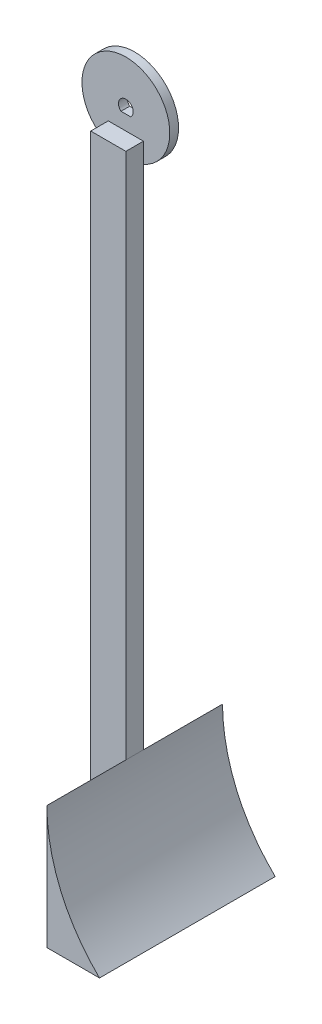
ISO-10303-21;
HEADER;
FILE_DESCRIPTION(('STEP AP214'),'2;1');
FILE_NAME('part.step','',(''),(''),'','','');
FILE_SCHEMA(('AUTOMOTIVE_DESIGN { 1 0 10303 214 1 1 1 1 }'));
ENDSEC;
DATA;
#1=APPLICATION_CONTEXT('core data for automotive mechanical design processes');
#2=APPLICATION_PROTOCOL_DEFINITION('international standard','automotive_design',2000,#1);
#3=PRODUCT_CONTEXT('',#1,'mechanical');
#4=PRODUCT('Part','Part','',(#3));
#5=PRODUCT_RELATED_PRODUCT_CATEGORY('part','',(#4));
#6=PRODUCT_DEFINITION_FORMATION('','',#4);
#7=PRODUCT_DEFINITION_CONTEXT('part definition',#1,'design');
#8=PRODUCT_DEFINITION('design','',#6,#7);
#9=PRODUCT_DEFINITION_SHAPE('','',#8);
#10=(LENGTH_UNIT() NAMED_UNIT(*) SI_UNIT(.MILLI.,.METRE.));
#11=(NAMED_UNIT(*) PLANE_ANGLE_UNIT() SI_UNIT($,.RADIAN.));
#12=(NAMED_UNIT(*) SI_UNIT($,.STERADIAN.) SOLID_ANGLE_UNIT());
#13=UNCERTAINTY_MEASURE_WITH_UNIT(LENGTH_MEASURE(1.E-05),#10,'distance_accuracy_value','');
#14=(GEOMETRIC_REPRESENTATION_CONTEXT(3) GLOBAL_UNCERTAINTY_ASSIGNED_CONTEXT((#13)) GLOBAL_UNIT_ASSIGNED_CONTEXT((#10,
#11,#12)) REPRESENTATION_CONTEXT('',''));
#15=CARTESIAN_POINT('',(0.,0.,0.));
#16=DIRECTION('',(0.,0.,1.));
#17=DIRECTION('',(1.,0.,0.));
#18=AXIS2_PLACEMENT_3D('',#15,#16,#17);
#19=CARTESIAN_POINT('',(5.,0.,0.));
#20=DIRECTION('',(1.,0.,0.));
#21=DIRECTION('',(0.,1.,0.));
#22=AXIS2_PLACEMENT_3D('',#19,#20,#21);
#23=PLANE('',#22);
#24=DIRECTION('',(0.,1.,0.));
#25=VECTOR('',#24,1.);
#26=CARTESIAN_POINT('',(5.,0.,7.5));
#27=LINE('',#26,#25);
#28=CARTESIAN_POINT('',(5.,-190.754430390358,7.5));
#29=VERTEX_POINT('',#28);
#30=CARTESIAN_POINT('',(5.00000000000002,-155.754430390358,7.49999999999999));
#31=VERTEX_POINT('',#30);
#32=EDGE_CURVE('E175',#29,#31,#27,.T.);
#33=ORIENTED_EDGE('',*,*,#32,.F.);
#34=DIRECTION('',(0.,0.,1.));
#35=VECTOR('',#34,1.);
#36=CARTESIAN_POINT('',(5.00000000000002,-190.754430390358,0.));
#37=LINE('',#36,#35);
#38=CARTESIAN_POINT('',(5.00000000000002,-190.754430390358,30.));
#39=VERTEX_POINT('',#38);
#40=EDGE_CURVE('E165',#29,#39,#37,.T.);
#41=ORIENTED_EDGE('',*,*,#40,.T.);
#42=DIRECTION('',(0.,-1.,0.));
#43=VECTOR('',#42,1.);
#44=CARTESIAN_POINT('',(5.,0.,30.));
#45=LINE('',#44,#43);
#46=CARTESIAN_POINT('',(5.00000000000002,-155.754430390358,30.));
#47=VERTEX_POINT('',#46);
#48=EDGE_CURVE('E308',#47,#39,#45,.T.);
#49=ORIENTED_EDGE('',*,*,#48,.F.);
#50=DIRECTION('',(0.,0.,-1.));
#51=VECTOR('',#50,1.);
#52=CARTESIAN_POINT('',(5.00000000000002,-155.754430390358,0.));
#53=LINE('',#52,#51);
#54=EDGE_CURVE('E155',#47,#31,#53,.T.);
#55=ORIENTED_EDGE('',*,*,#54,.T.);
#56=EDGE_LOOP('',(#33,#41,#49,#55));
#57=FACE_BOUND('',#56,.T.);
#58=ADVANCED_FACE('F47',(#57),#23,.F.);
#59=CARTESIAN_POINT('',(0.,0.,2.5));
#60=DIRECTION('',(0.,0.,-1.));
#61=DIRECTION('',(-1.,0.,0.));
#62=AXIS2_PLACEMENT_3D('',#59,#60,#61);
#63=CYLINDRICAL_SURFACE('',#62,2.1);
#64=CARTESIAN_POINT('',(0.,0.,0.));
#65=DIRECTION('',(0.,0.,1.));
#66=DIRECTION('',(1.,0.,0.));
#67=AXIS2_PLACEMENT_3D('',#64,#65,#66);
#68=CIRCLE('',#67,2.1);
#69=CARTESIAN_POINT('',(1.38901943830891,-1.575,0.));
#70=VERTEX_POINT('',#69);
#71=CARTESIAN_POINT('',(-1.38901943830891,-1.575,0.));
#72=VERTEX_POINT('',#71);
#73=EDGE_CURVE('E201',#70,#72,#68,.T.);
#74=ORIENTED_EDGE('',*,*,#73,.F.);
#75=DIRECTION('',(0.,0.,-1.));
#76=VECTOR('',#75,1.);
#77=CARTESIAN_POINT('',(1.38901943830891,-1.575,2.5));
#78=LINE('',#77,#76);
#79=CARTESIAN_POINT('',(1.38901943830891,-1.575,2.5));
#80=VERTEX_POINT('',#79);
#81=EDGE_CURVE('E51',#80,#70,#78,.T.);
#82=ORIENTED_EDGE('',*,*,#81,.F.);
#83=CARTESIAN_POINT('',(0.,0.,2.5));
#84=DIRECTION('',(0.,0.,1.));
#85=DIRECTION('',(1.,0.,0.));
#86=AXIS2_PLACEMENT_3D('',#83,#84,#85);
#87=CIRCLE('',#86,2.1);
#88=CARTESIAN_POINT('',(-1.38901943830891,-1.575,2.5));
#89=VERTEX_POINT('',#88);
#90=EDGE_CURVE('E202',#80,#89,#87,.T.);
#91=ORIENTED_EDGE('',*,*,#90,.T.);
#92=DIRECTION('',(0.,0.,-1.));
#93=VECTOR('',#92,1.);
#94=CARTESIAN_POINT('',(-1.38901943830891,-1.575,2.5));
#95=LINE('',#94,#93);
#96=EDGE_CURVE('E216',#89,#72,#95,.T.);
#97=ORIENTED_EDGE('',*,*,#96,.T.);
#98=EDGE_LOOP('',(#74,#82,#91,#97));
#99=FACE_BOUND('',#98,.T.);
#100=ADVANCED_FACE('F49',(#99),#63,.F.);
#101=CARTESIAN_POINT('',(0.,-1.575,2.5));
#102=DIRECTION('',(0.,1.,0.));
#103=DIRECTION('',(-1.,0.,0.));
#104=AXIS2_PLACEMENT_3D('',#101,#102,#103);
#105=PLANE('',#104);
#106=DIRECTION('',(1.,0.,0.));
#107=VECTOR('',#106,1.);
#108=CARTESIAN_POINT('',(0.,-1.575,0.));
#109=LINE('',#108,#107);
#110=EDGE_CURVE('E220',#72,#70,#109,.T.);
#111=ORIENTED_EDGE('',*,*,#110,.F.);
#112=ORIENTED_EDGE('',*,*,#96,.F.);
#113=DIRECTION('',(1.,0.,0.));
#114=VECTOR('',#113,1.);
#115=CARTESIAN_POINT('',(0.,-1.575,2.5));
#116=LINE('',#115,#114);
#117=EDGE_CURVE('E206',#89,#80,#116,.T.);
#118=ORIENTED_EDGE('',*,*,#117,.T.);
#119=ORIENTED_EDGE('',*,*,#81,.T.);
#120=EDGE_LOOP('',(#111,#112,#118,#119));
#121=FACE_BOUND('',#120,.T.);
#122=ADVANCED_FACE('F232',(#121),#105,.T.);
#123=CARTESIAN_POINT('',(0.,0.,2.5));
#124=DIRECTION('',(0.,0.,-1.));
#125=DIRECTION('',(-1.,0.,0.));
#126=AXIS2_PLACEMENT_3D('',#123,#124,#125);
#127=CYLINDRICAL_SURFACE('',#126,12.5);
#128=CARTESIAN_POINT('',(0.,0.,2.5));
#129=DIRECTION('',(0.,0.,1.));
#130=DIRECTION('',(1.,0.,0.));
#131=AXIS2_PLACEMENT_3D('',#128,#129,#130);
#132=CIRCLE('',#131,12.5);
#133=CARTESIAN_POINT('',(-5.,-11.4564392373896,2.5));
#134=VERTEX_POINT('',#133);
#135=CARTESIAN_POINT('',(5.,-11.4564392373896,2.5));
#136=VERTEX_POINT('',#135);
#137=EDGE_CURVE('E212',#134,#136,#132,.T.);
#138=ORIENTED_EDGE('',*,*,#137,.F.);
#139=EDGE_CURVE('E211',#136,#134,#132,.T.);
#140=ORIENTED_EDGE('',*,*,#139,.F.);
#141=EDGE_LOOP('',(#138,#140));
#142=FACE_BOUND('',#141,.T.);
#143=CARTESIAN_POINT('',(0.,0.,0.));
#144=DIRECTION('',(0.,0.,1.));
#145=DIRECTION('',(1.,0.,0.));
#146=AXIS2_PLACEMENT_3D('',#143,#144,#145);
#147=CIRCLE('',#146,12.5);
#148=CARTESIAN_POINT('',(12.5,0.,0.));
#149=VERTEX_POINT('',#148);
#150=EDGE_CURVE('E207',#149,#149,#147,.T.);
#151=ORIENTED_EDGE('',*,*,#150,.T.);
#152=EDGE_LOOP('',(#151));
#153=FACE_BOUND('',#152,.T.);
#154=ADVANCED_FACE('F244',(#142,#153),#127,.T.);
#155=CARTESIAN_POINT('',(0.,0.,2.5));
#156=DIRECTION('',(0.,0.,1.));
#157=DIRECTION('',(1.,0.,0.));
#158=AXIS2_PLACEMENT_3D('',#155,#156,#157);
#159=PLANE('',#158);
#160=DIRECTION('',(0.,-1.,0.));
#161=VECTOR('',#160,1.);
#162=CARTESIAN_POINT('',(-5.,0.,2.5));
#163=LINE('',#162,#161);
#164=CARTESIAN_POINT('',(-5.,-5.75443039035809,2.5));
#165=VERTEX_POINT('',#164);
#166=EDGE_CURVE('E73',#165,#134,#163,.T.);
#167=ORIENTED_EDGE('',*,*,#166,.F.);
#168=DIRECTION('',(1.,0.,0.));
#169=VECTOR('',#168,1.);
#170=CARTESIAN_POINT('',(0.,-5.75443039035809,2.5));
#171=LINE('',#170,#169);
#172=CARTESIAN_POINT('',(5.,-5.75443039035809,2.5));
#173=VERTEX_POINT('',#172);
#174=EDGE_CURVE('E189',#165,#173,#171,.T.);
#175=ORIENTED_EDGE('',*,*,#174,.T.);
#176=DIRECTION('',(0.,1.,0.));
#177=VECTOR('',#176,1.);
#178=CARTESIAN_POINT('',(5.,0.,2.5));
#179=LINE('',#178,#177);
#180=EDGE_CURVE('E11',#136,#173,#179,.T.);
#181=ORIENTED_EDGE('',*,*,#180,.F.);
#182=ORIENTED_EDGE('',*,*,#139,.T.);
#183=EDGE_LOOP('',(#167,#175,#181,#182));
#184=FACE_BOUND('',#183,.T.);
#185=ORIENTED_EDGE('',*,*,#90,.F.);
#186=ORIENTED_EDGE('',*,*,#117,.F.);
#187=EDGE_LOOP('',(#185,#186));
#188=FACE_BOUND('',#187,.T.);
#189=ADVANCED_FACE('F240',(#184,#188),#159,.T.);
#190=CARTESIAN_POINT('',(0.,0.,0.));
#191=DIRECTION('',(0.,0.,1.));
#192=DIRECTION('',(1.,0.,0.));
#193=AXIS2_PLACEMENT_3D('',#190,#191,#192);
#194=PLANE('',#193);
#195=ORIENTED_EDGE('',*,*,#73,.T.);
#196=ORIENTED_EDGE('',*,*,#110,.T.);
#197=EDGE_LOOP('',(#195,#196));
#198=FACE_BOUND('',#197,.T.);
#199=ORIENTED_EDGE('',*,*,#150,.F.);
#200=EDGE_LOOP('',(#199));
#201=FACE_BOUND('',#200,.T.);
#202=ADVANCED_FACE('F236',(#198,#201),#194,.F.);
#203=CARTESIAN_POINT('',(0.,0.,2.5));
#204=DIRECTION('',(0.,0.,1.));
#205=DIRECTION('',(1.,0.,0.));
#206=AXIS2_PLACEMENT_3D('',#203,#204,#205);
#207=PLANE('',#206);
#208=CARTESIAN_POINT('',(-4.99999999999998,-190.754430390358,2.5));
#209=VERTEX_POINT('',#208);
#210=EDGE_CURVE('E192',#134,#209,#163,.T.);
#211=ORIENTED_EDGE('',*,*,#210,.F.);
#212=ORIENTED_EDGE('',*,*,#137,.T.);
#213=CARTESIAN_POINT('',(5.00000000000002,-155.754430390358,2.5));
#214=VERTEX_POINT('',#213);
#215=EDGE_CURVE('E59',#214,#136,#179,.T.);
#216=ORIENTED_EDGE('',*,*,#215,.F.);
#217=CARTESIAN_POINT('',(5.00000000000002,-190.754430390358,2.5));
#218=VERTEX_POINT('',#217);
#219=EDGE_CURVE('E58',#218,#214,#179,.T.);
#220=ORIENTED_EDGE('',*,*,#219,.F.);
#221=DIRECTION('',(-1.,0.,0.));
#222=VECTOR('',#221,1.);
#223=CARTESIAN_POINT('',(5.,-190.754430390358,2.5));
#224=LINE('',#223,#222);
#225=EDGE_CURVE('E313',#218,#209,#224,.T.);
#226=ORIENTED_EDGE('',*,*,#225,.T.);
#227=EDGE_LOOP('',(#211,#212,#216,#220,#226));
#228=FACE_BOUND('',#227,.T.);
#229=ADVANCED_FACE('F239',(#228),#207,.F.);
#230=CARTESIAN_POINT('',(5.,0.,7.5));
#231=DIRECTION('',(-1.,0.,0.));
#232=DIRECTION('',(0.,-1.,0.));
#233=AXIS2_PLACEMENT_3D('',#230,#231,#232);
#234=PLANE('',#233);
#235=CARTESIAN_POINT('',(5.,-5.75443039035809,7.5));
#236=VERTEX_POINT('',#235);
#237=EDGE_CURVE('E180',#31,#236,#27,.T.);
#238=ORIENTED_EDGE('',*,*,#237,.F.);
#239=EDGE_CURVE('E152',#31,#214,#53,.T.);
#240=ORIENTED_EDGE('',*,*,#239,.T.);
#241=ORIENTED_EDGE('',*,*,#215,.T.);
#242=ORIENTED_EDGE('',*,*,#180,.T.);
#243=DIRECTION('',(0.,0.,-1.));
#244=VECTOR('',#243,1.);
#245=CARTESIAN_POINT('',(5.,-5.75443039035809,7.5));
#246=LINE('',#245,#244);
#247=EDGE_CURVE('E197',#236,#173,#246,.T.);
#248=ORIENTED_EDGE('',*,*,#247,.F.);
#249=EDGE_LOOP('',(#238,#240,#241,#242,#248));
#250=FACE_BOUND('',#249,.T.);
#251=ADVANCED_FACE('F285',(#250),#234,.F.);
#252=CARTESIAN_POINT('',(0.,-5.75443039035809,7.5));
#253=DIRECTION('',(0.,1.,0.));
#254=DIRECTION('',(0.,0.,1.));
#255=AXIS2_PLACEMENT_3D('',#252,#253,#254);
#256=PLANE('',#255);
#257=ORIENTED_EDGE('',*,*,#174,.F.);
#258=DIRECTION('',(0.,0.,-1.));
#259=VECTOR('',#258,1.);
#260=CARTESIAN_POINT('',(-5.,-5.75443039035809,7.5));
#261=LINE('',#260,#259);
#262=CARTESIAN_POINT('',(-5.,-5.75443039035809,7.5));
#263=VERTEX_POINT('',#262);
#264=EDGE_CURVE('E186',#263,#165,#261,.T.);
#265=ORIENTED_EDGE('',*,*,#264,.F.);
#266=DIRECTION('',(1.,0.,0.));
#267=VECTOR('',#266,1.);
#268=CARTESIAN_POINT('',(0.,-5.75443039035809,7.5));
#269=LINE('',#268,#267);
#270=EDGE_CURVE('E179',#263,#236,#269,.T.);
#271=ORIENTED_EDGE('',*,*,#270,.T.);
#272=ORIENTED_EDGE('',*,*,#247,.T.);
#273=EDGE_LOOP('',(#257,#265,#271,#272));
#274=FACE_BOUND('',#273,.T.);
#275=ADVANCED_FACE('F280',(#274),#256,.T.);
#276=CARTESIAN_POINT('',(-5.,0.,7.5));
#277=DIRECTION('',(1.,0.,0.));
#278=DIRECTION('',(0.,1.,0.));
#279=AXIS2_PLACEMENT_3D('',#276,#277,#278);
#280=PLANE('',#279);
#281=ORIENTED_EDGE('',*,*,#166,.T.);
#282=ORIENTED_EDGE('',*,*,#210,.T.);
#283=DIRECTION('',(0.,0.,1.));
#284=VECTOR('',#283,1.);
#285=CARTESIAN_POINT('',(-4.99999999999998,-190.754430390358,2.5));
#286=LINE('',#285,#284);
#287=CARTESIAN_POINT('',(-4.99999999999998,-190.754430390358,7.5));
#288=VERTEX_POINT('',#287);
#289=EDGE_CURVE('E316',#209,#288,#286,.T.);
#290=ORIENTED_EDGE('',*,*,#289,.T.);
#291=DIRECTION('',(0.,-1.,0.));
#292=VECTOR('',#291,1.);
#293=CARTESIAN_POINT('',(-5.,0.,7.5));
#294=LINE('',#293,#292);
#295=EDGE_CURVE('E184',#263,#288,#294,.T.);
#296=ORIENTED_EDGE('',*,*,#295,.F.);
#297=ORIENTED_EDGE('',*,*,#264,.T.);
#298=EDGE_LOOP('',(#281,#282,#290,#296,#297));
#299=FACE_BOUND('',#298,.T.);
#300=ADVANCED_FACE('F274',(#299),#280,.F.);
#301=CARTESIAN_POINT('',(0.,0.,7.5));
#302=DIRECTION('',(0.,0.,1.));
#303=DIRECTION('',(1.,0.,0.));
#304=AXIS2_PLACEMENT_3D('',#301,#302,#303);
#305=PLANE('',#304);
#306=ORIENTED_EDGE('',*,*,#295,.T.);
#307=DIRECTION('',(-1.,0.,0.));
#308=VECTOR('',#307,1.);
#309=CARTESIAN_POINT('',(5.,-190.754430390358,7.5));
#310=LINE('',#309,#308);
#311=EDGE_CURVE('E153',#29,#288,#310,.T.);
#312=ORIENTED_EDGE('',*,*,#311,.F.);
#313=ORIENTED_EDGE('',*,*,#32,.T.);
#314=ORIENTED_EDGE('',*,*,#237,.T.);
#315=ORIENTED_EDGE('',*,*,#270,.F.);
#316=EDGE_LOOP('',(#306,#312,#313,#314,#315));
#317=FACE_BOUND('',#316,.T.);
#318=ADVANCED_FACE('F266',(#317),#305,.T.);
#319=CARTESIAN_POINT('',(5.00000000000002,-190.754430390358,-20.));
#320=VERTEX_POINT('',#319);
#321=EDGE_CURVE('E160',#320,#218,#37,.T.);
#322=ORIENTED_EDGE('',*,*,#321,.T.);
#323=ORIENTED_EDGE('',*,*,#219,.T.);
#324=CARTESIAN_POINT('',(5.00000000000002,-155.754430390358,-20.));
#325=VERTEX_POINT('',#324);
#326=EDGE_CURVE('E137',#214,#325,#53,.T.);
#327=ORIENTED_EDGE('',*,*,#326,.T.);
#328=DIRECTION('',(0.,-1.,0.));
#329=VECTOR('',#328,1.);
#330=CARTESIAN_POINT('',(5.,0.,-20.));
#331=LINE('',#330,#329);
#332=EDGE_CURVE('E149',#325,#320,#331,.T.);
#333=ORIENTED_EDGE('',*,*,#332,.T.);
#334=EDGE_LOOP('',(#322,#323,#327,#333));
#335=FACE_BOUND('',#334,.T.);
#336=ADVANCED_FACE('F148',(#335),#23,.F.);
#337=CARTESIAN_POINT('',(20.,0.,30.));
#338=DIRECTION('',(0.,0.,-1.));
#339=DIRECTION('',(0.,1.,0.));
#340=AXIS2_PLACEMENT_3D('',#337,#338,#339);
#341=PLANE('',#340);
#342=DIRECTION('',(-1.,0.,0.));
#343=VECTOR('',#342,1.);
#344=CARTESIAN_POINT('',(20.,-190.754430390358,30.));
#345=LINE('',#344,#343);
#346=CARTESIAN_POINT('',(20.,-190.754430390358,30.));
#347=VERTEX_POINT('',#346);
#348=EDGE_CURVE('E171',#347,#39,#345,.T.);
#349=ORIENTED_EDGE('',*,*,#348,.F.);
#350=CARTESIAN_POINT('',(54.0318899837118,-155.455048968767,30.));
#351=DIRECTION('',(0.,0.,-1.));
#352=DIRECTION('',(0.,1.,0.));
#353=AXIS2_PLACEMENT_3D('',#350,#351,#352);
#354=CIRCLE('',#353,49.0328039643911);
#355=EDGE_CURVE('E144',#347,#47,#354,.T.);
#356=ORIENTED_EDGE('',*,*,#355,.T.);
#357=ORIENTED_EDGE('',*,*,#48,.T.);
#358=EDGE_LOOP('',(#349,#356,#357));
#359=FACE_BOUND('',#358,.T.);
#360=ADVANCED_FACE('F265',(#359),#341,.F.);
#361=CARTESIAN_POINT('',(20.,-190.754430390358,0.));
#362=DIRECTION('',(0.,-1.,0.));
#363=DIRECTION('',(1.,0.,0.));
#364=AXIS2_PLACEMENT_3D('',#361,#362,#363);
#365=PLANE('',#364);
#366=ORIENTED_EDGE('',*,*,#321,.F.);
#367=DIRECTION('',(-1.,0.,0.));
#368=VECTOR('',#367,1.);
#369=CARTESIAN_POINT('',(20.,-190.754430390358,-20.));
#370=LINE('',#369,#368);
#371=CARTESIAN_POINT('',(20.,-190.754430390358,-20.));
#372=VERTEX_POINT('',#371);
#373=EDGE_CURVE('E157',#372,#320,#370,.T.);
#374=ORIENTED_EDGE('',*,*,#373,.F.);
#375=DIRECTION('',(0.,0.,1.));
#376=VECTOR('',#375,1.);
#377=CARTESIAN_POINT('',(20.,-190.754430390358,0.));
#378=LINE('',#377,#376);
#379=EDGE_CURVE('E139',#372,#347,#378,.T.);
#380=ORIENTED_EDGE('',*,*,#379,.T.);
#381=ORIENTED_EDGE('',*,*,#348,.T.);
#382=ORIENTED_EDGE('',*,*,#40,.F.);
#383=ORIENTED_EDGE('',*,*,#311,.T.);
#384=ORIENTED_EDGE('',*,*,#289,.F.);
#385=ORIENTED_EDGE('',*,*,#225,.F.);
#386=EDGE_LOOP('',(#366,#374,#380,#381,#382,#383,#384,#385));
#387=FACE_BOUND('',#386,.T.);
#388=ADVANCED_FACE('F271',(#387),#365,.T.);
#389=CARTESIAN_POINT('',(20.,0.,-20.));
#390=DIRECTION('',(0.,0.,-1.));
#391=DIRECTION('',(0.,1.,0.));
#392=AXIS2_PLACEMENT_3D('',#389,#390,#391);
#393=PLANE('',#392);
#394=CARTESIAN_POINT('',(54.0318899837118,-155.455048968767,-20.));
#395=DIRECTION('',(0.,0.,-1.));
#396=DIRECTION('',(0.,-1.,0.));
#397=AXIS2_PLACEMENT_3D('',#394,#395,#396);
#398=CIRCLE('',#397,49.0328039643911);
#399=EDGE_CURVE('E134',#372,#325,#398,.T.);
#400=ORIENTED_EDGE('',*,*,#399,.F.);
#401=ORIENTED_EDGE('',*,*,#373,.T.);
#402=ORIENTED_EDGE('',*,*,#332,.F.);
#403=EDGE_LOOP('',(#400,#401,#402));
#404=FACE_BOUND('',#403,.T.);
#405=ADVANCED_FACE('F156',(#404),#393,.T.);
#406=CARTESIAN_POINT('',(54.0318899837118,-155.455048968767,122.));
#407=DIRECTION('',(0.,0.,-1.));
#408=DIRECTION('',(0.,1.,0.));
#409=AXIS2_PLACEMENT_3D('',#406,#407,#408);
#410=CYLINDRICAL_SURFACE('',#409,49.0328039643911);
#411=ORIENTED_EDGE('',*,*,#379,.F.);
#412=ORIENTED_EDGE('',*,*,#399,.T.);
#413=ORIENTED_EDGE('',*,*,#326,.F.);
#414=ORIENTED_EDGE('',*,*,#239,.F.);
#415=ORIENTED_EDGE('',*,*,#54,.F.);
#416=ORIENTED_EDGE('',*,*,#355,.F.);
#417=EDGE_LOOP('',(#411,#412,#413,#414,#415,#416));
#418=FACE_BOUND('',#417,.T.);
#419=ADVANCED_FACE('F136',(#418),#410,.F.);
#420=CLOSED_SHELL('',(#58,#100,#122,#154,#189,#202,#229,#251,#275,#300,#318,#336,#360,#388,#405,#419));
#421=MANIFOLD_SOLID_BREP('B2',#420);
#422=ADVANCED_BREP_SHAPE_REPRESENTATION('',(#18,#421),#14);
#423=SHAPE_DEFINITION_REPRESENTATION(#9,#422);
ENDSEC;
END-ISO-10303-21;
